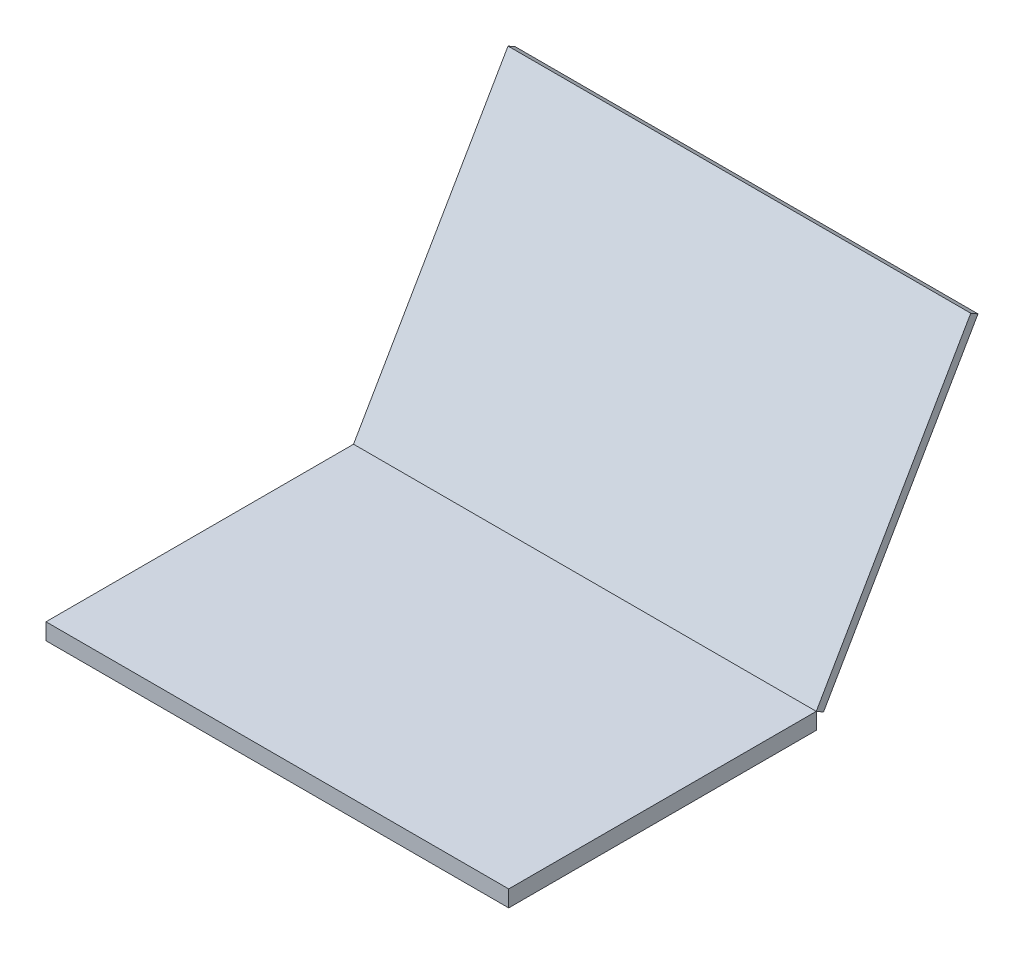
ISO-10303-21;
HEADER;
FILE_DESCRIPTION(('STEP AP214'),'2;1');
FILE_NAME('part.step','',(''),(''),'','','');
FILE_SCHEMA(('AUTOMOTIVE_DESIGN { 1 0 10303 214 1 1 1 1 }'));
ENDSEC;
DATA;
#1=APPLICATION_CONTEXT('core data for automotive mechanical design processes');
#2=APPLICATION_PROTOCOL_DEFINITION('international standard','automotive_design',2000,#1);
#3=PRODUCT_CONTEXT('',#1,'mechanical');
#4=PRODUCT('Part','Part','',(#3));
#5=PRODUCT_RELATED_PRODUCT_CATEGORY('part','',(#4));
#6=PRODUCT_DEFINITION_FORMATION('','',#4);
#7=PRODUCT_DEFINITION_CONTEXT('part definition',#1,'design');
#8=PRODUCT_DEFINITION('design','',#6,#7);
#9=PRODUCT_DEFINITION_SHAPE('','',#8);
#10=(LENGTH_UNIT() NAMED_UNIT(*) SI_UNIT(.MILLI.,.METRE.));
#11=(NAMED_UNIT(*) PLANE_ANGLE_UNIT() SI_UNIT($,.RADIAN.));
#12=(NAMED_UNIT(*) SI_UNIT($,.STERADIAN.) SOLID_ANGLE_UNIT());
#13=UNCERTAINTY_MEASURE_WITH_UNIT(LENGTH_MEASURE(1.E-05),#10,'distance_accuracy_value','');
#14=(GEOMETRIC_REPRESENTATION_CONTEXT(3) GLOBAL_UNCERTAINTY_ASSIGNED_CONTEXT((#13)) GLOBAL_UNIT_ASSIGNED_CONTEXT((#10,
#11,#12)) REPRESENTATION_CONTEXT('',''));
#15=CARTESIAN_POINT('',(0.,0.,0.));
#16=DIRECTION('',(0.,0.,1.));
#17=DIRECTION('',(1.,0.,0.));
#18=AXIS2_PLACEMENT_3D('',#15,#16,#17);
#19=CARTESIAN_POINT('',(165.5,11.78,-110.));
#20=DIRECTION('',(-1.,0.,0.));
#21=DIRECTION('',(0.,0.499999999999998,0.86602540378444));
#22=AXIS2_PLACEMENT_3D('',#19,#20,#21);
#23=PLANE('',#22);
#24=DIRECTION('',(0.,0.86602540378444,-0.499999999999998));
#25=VECTOR('',#24,1.);
#26=CARTESIAN_POINT('',(165.5,8.78000000000001,-115.196152422707));
#27=LINE('',#26,#25);
#28=CARTESIAN_POINT('',(165.5,8.78000000000001,-115.196152422707));
#29=VERTEX_POINT('',#28);
#30=CARTESIAN_POINT('',(165.5,200.171614236361,-225.696152422706));
#31=VERTEX_POINT('',#30);
#32=EDGE_CURVE('E110',#29,#31,#27,.T.);
#33=ORIENTED_EDGE('',*,*,#32,.T.);
#34=DIRECTION('',(0.,-0.499999999999998,-0.86602540378444));
#35=VECTOR('',#34,1.);
#36=CARTESIAN_POINT('',(165.5,203.171614236361,-220.5));
#37=LINE('',#36,#35);
#38=CARTESIAN_POINT('',(165.5,203.171614236361,-220.5));
#39=VERTEX_POINT('',#38);
#40=EDGE_CURVE('E12',#39,#31,#37,.T.);
#41=ORIENTED_EDGE('',*,*,#40,.F.);
#42=DIRECTION('',(0.,0.86602540378444,-0.499999999999998));
#43=VECTOR('',#42,1.);
#44=CARTESIAN_POINT('',(165.5,11.78,-110.));
#45=LINE('',#44,#43);
#46=CARTESIAN_POINT('',(165.5,11.78,-110.));
#47=VERTEX_POINT('',#46);
#48=EDGE_CURVE('E98',#47,#39,#45,.T.);
#49=ORIENTED_EDGE('',*,*,#48,.F.);
#50=DIRECTION('',(0.,-0.499999999999998,-0.86602540378444));
#51=VECTOR('',#50,1.);
#52=CARTESIAN_POINT('',(165.5,11.78,-110.));
#53=LINE('',#52,#51);
#54=EDGE_CURVE('E106',#47,#29,#53,.T.);
#55=ORIENTED_EDGE('',*,*,#54,.T.);
#56=EDGE_LOOP('',(#33,#41,#49,#55));
#57=FACE_BOUND('',#56,.T.);
#58=ADVANCED_FACE('F47',(#57),#23,.F.);
#59=CARTESIAN_POINT('',(-165.5,203.171614236361,-220.5));
#60=DIRECTION('',(0.,-0.86602540378444,0.499999999999998));
#61=DIRECTION('',(0.,-0.499999999999998,-0.86602540378444));
#62=AXIS2_PLACEMENT_3D('',#59,#60,#61);
#63=PLANE('',#62);
#64=DIRECTION('',(-1.,0.,0.));
#65=VECTOR('',#64,1.);
#66=CARTESIAN_POINT('',(-165.5,200.171614236361,-225.696152422706));
#67=LINE('',#66,#65);
#68=CARTESIAN_POINT('',(-165.5,200.171614236361,-225.696152422706));
#69=VERTEX_POINT('',#68);
#70=EDGE_CURVE('E102',#31,#69,#67,.T.);
#71=ORIENTED_EDGE('',*,*,#70,.T.);
#72=DIRECTION('',(0.,-0.499999999999998,-0.86602540378444));
#73=VECTOR('',#72,1.);
#74=CARTESIAN_POINT('',(-165.5,203.171614236361,-220.5));
#75=LINE('',#74,#73);
#76=CARTESIAN_POINT('',(-165.5,203.171614236361,-220.5));
#77=VERTEX_POINT('',#76);
#78=EDGE_CURVE('E55',#77,#69,#75,.T.);
#79=ORIENTED_EDGE('',*,*,#78,.F.);
#80=DIRECTION('',(-1.,0.,0.));
#81=VECTOR('',#80,1.);
#82=CARTESIAN_POINT('',(-165.5,203.171614236361,-220.5));
#83=LINE('',#82,#81);
#84=EDGE_CURVE('E93',#39,#77,#83,.T.);
#85=ORIENTED_EDGE('',*,*,#84,.F.);
#86=ORIENTED_EDGE('',*,*,#40,.T.);
#87=EDGE_LOOP('',(#71,#79,#85,#86));
#88=FACE_BOUND('',#87,.T.);
#89=ADVANCED_FACE('F101',(#88),#63,.F.);
#90=CARTESIAN_POINT('',(-165.5,11.78,-110.));
#91=DIRECTION('',(1.,0.,0.));
#92=DIRECTION('',(0.,-0.499999999999998,-0.86602540378444));
#93=AXIS2_PLACEMENT_3D('',#90,#91,#92);
#94=PLANE('',#93);
#95=DIRECTION('',(0.,-0.86602540378444,0.499999999999998));
#96=VECTOR('',#95,1.);
#97=CARTESIAN_POINT('',(-165.5,8.78000000000001,-115.196152422707));
#98=LINE('',#97,#96);
#99=CARTESIAN_POINT('',(-165.5,8.78000000000001,-115.196152422707));
#100=VERTEX_POINT('',#99);
#101=EDGE_CURVE('E80',#69,#100,#98,.T.);
#102=ORIENTED_EDGE('',*,*,#101,.T.);
#103=DIRECTION('',(0.,-0.499999999999998,-0.86602540378444));
#104=VECTOR('',#103,1.);
#105=CARTESIAN_POINT('',(-165.5,11.78,-110.));
#106=LINE('',#105,#104);
#107=CARTESIAN_POINT('',(-165.5,11.78,-110.));
#108=VERTEX_POINT('',#107);
#109=EDGE_CURVE('E103',#108,#100,#106,.T.);
#110=ORIENTED_EDGE('',*,*,#109,.F.);
#111=DIRECTION('',(0.,-0.86602540378444,0.499999999999998));
#112=VECTOR('',#111,1.);
#113=CARTESIAN_POINT('',(-165.5,11.78,-110.));
#114=LINE('',#113,#112);
#115=EDGE_CURVE('E96',#77,#108,#114,.T.);
#116=ORIENTED_EDGE('',*,*,#115,.F.);
#117=ORIENTED_EDGE('',*,*,#78,.T.);
#118=EDGE_LOOP('',(#102,#110,#116,#117));
#119=FACE_BOUND('',#118,.T.);
#120=ADVANCED_FACE('F104',(#119),#94,.F.);
#121=CARTESIAN_POINT('',(-165.5,11.78,-110.));
#122=DIRECTION('',(0.,0.86602540378444,-0.499999999999998));
#123=DIRECTION('',(0.,0.499999999999998,0.86602540378444));
#124=AXIS2_PLACEMENT_3D('',#121,#122,#123);
#125=PLANE('',#124);
#126=DIRECTION('',(1.,0.,0.));
#127=VECTOR('',#126,1.);
#128=CARTESIAN_POINT('',(-165.5,8.78000000000001,-115.196152422707));
#129=LINE('',#128,#127);
#130=EDGE_CURVE('E86',#100,#29,#129,.T.);
#131=ORIENTED_EDGE('',*,*,#130,.T.);
#132=ORIENTED_EDGE('',*,*,#54,.F.);
#133=DIRECTION('',(1.,0.,0.));
#134=VECTOR('',#133,1.);
#135=CARTESIAN_POINT('',(-165.5,11.78,-110.));
#136=LINE('',#135,#134);
#137=EDGE_CURVE('E63',#108,#47,#136,.T.);
#138=ORIENTED_EDGE('',*,*,#137,.F.);
#139=ORIENTED_EDGE('',*,*,#109,.T.);
#140=EDGE_LOOP('',(#131,#132,#138,#139));
#141=FACE_BOUND('',#140,.T.);
#142=ADVANCED_FACE('F117',(#141),#125,.F.);
#143=CARTESIAN_POINT('',(0.,107.475807118181,-165.25));
#144=DIRECTION('',(0.,-0.499999999999998,-0.86602540378444));
#145=DIRECTION('',(-1.,0.,0.));
#146=AXIS2_PLACEMENT_3D('',#143,#144,#145);
#147=PLANE('',#146);
#148=ORIENTED_EDGE('',*,*,#48,.T.);
#149=ORIENTED_EDGE('',*,*,#84,.T.);
#150=ORIENTED_EDGE('',*,*,#115,.T.);
#151=ORIENTED_EDGE('',*,*,#137,.T.);
#152=EDGE_LOOP('',(#148,#149,#150,#151));
#153=FACE_BOUND('',#152,.T.);
#154=ADVANCED_FACE('F94',(#153),#147,.F.);
#155=CARTESIAN_POINT('',(0.,104.475807118181,-170.446152422706));
#156=DIRECTION('',(0.,-0.499999999999998,-0.86602540378444));
#157=DIRECTION('',(-1.,0.,0.));
#158=AXIS2_PLACEMENT_3D('',#155,#156,#157);
#159=PLANE('',#158);
#160=ORIENTED_EDGE('',*,*,#32,.F.);
#161=ORIENTED_EDGE('',*,*,#130,.F.);
#162=ORIENTED_EDGE('',*,*,#101,.F.);
#163=ORIENTED_EDGE('',*,*,#70,.F.);
#164=EDGE_LOOP('',(#160,#161,#162,#163));
#165=FACE_BOUND('',#164,.T.);
#166=ADVANCED_FACE('F120',(#165),#159,.T.);
#167=CLOSED_SHELL('',(#58,#89,#120,#142,#154,#166));
#168=MANIFOLD_SOLID_BREP('B2',#167);
#169=CARTESIAN_POINT('',(165.5,11.78,110.));
#170=DIRECTION('',(-1.,0.,0.));
#171=DIRECTION('',(0.,0.,1.));
#172=AXIS2_PLACEMENT_3D('',#169,#170,#171);
#173=PLANE('',#172);
#174=DIRECTION('',(0.,0.,-1.));
#175=VECTOR('',#174,1.);
#176=CARTESIAN_POINT('',(165.5,0.,110.));
#177=LINE('',#176,#175);
#178=CARTESIAN_POINT('',(165.5,0.,110.));
#179=VERTEX_POINT('',#178);
#180=CARTESIAN_POINT('',(165.5,0.,-110.));
#181=VERTEX_POINT('',#180);
#182=EDGE_CURVE('E234',#179,#181,#177,.T.);
#183=ORIENTED_EDGE('',*,*,#182,.T.);
#184=DIRECTION('',(0.,-1.,0.));
#185=VECTOR('',#184,1.);
#186=CARTESIAN_POINT('',(165.5,11.78,-110.));
#187=LINE('',#186,#185);
#188=CARTESIAN_POINT('',(165.5,11.78,-110.));
#189=VERTEX_POINT('',#188);
#190=EDGE_CURVE('E45',#189,#181,#187,.T.);
#191=ORIENTED_EDGE('',*,*,#190,.F.);
#192=DIRECTION('',(0.,0.,-1.));
#193=VECTOR('',#192,1.);
#194=CARTESIAN_POINT('',(165.5,11.78,110.));
#195=LINE('',#194,#193);
#196=CARTESIAN_POINT('',(165.5,11.78,110.));
#197=VERTEX_POINT('',#196);
#198=EDGE_CURVE('E222',#197,#189,#195,.T.);
#199=ORIENTED_EDGE('',*,*,#198,.F.);
#200=DIRECTION('',(0.,-1.,0.));
#201=VECTOR('',#200,1.);
#202=CARTESIAN_POINT('',(165.5,11.78,110.));
#203=LINE('',#202,#201);
#204=EDGE_CURVE('E230',#197,#179,#203,.T.);
#205=ORIENTED_EDGE('',*,*,#204,.T.);
#206=EDGE_LOOP('',(#183,#191,#199,#205));
#207=FACE_BOUND('',#206,.T.);
#208=ADVANCED_FACE('F171',(#207),#173,.F.);
#209=CARTESIAN_POINT('',(-165.5,11.78,-110.));
#210=DIRECTION('',(0.,0.,1.));
#211=DIRECTION('',(1.,0.,0.));
#212=AXIS2_PLACEMENT_3D('',#209,#210,#211);
#213=PLANE('',#212);
#214=DIRECTION('',(-1.,0.,0.));
#215=VECTOR('',#214,1.);
#216=CARTESIAN_POINT('',(-165.5,0.,-110.));
#217=LINE('',#216,#215);
#218=CARTESIAN_POINT('',(-165.5,0.,-110.));
#219=VERTEX_POINT('',#218);
#220=EDGE_CURVE('E226',#181,#219,#217,.T.);
#221=ORIENTED_EDGE('',*,*,#220,.T.);
#222=DIRECTION('',(0.,-1.,0.));
#223=VECTOR('',#222,1.);
#224=CARTESIAN_POINT('',(-165.5,11.78,-110.));
#225=LINE('',#224,#223);
#226=CARTESIAN_POINT('',(-165.5,11.78,-110.));
#227=VERTEX_POINT('',#226);
#228=EDGE_CURVE('E179',#227,#219,#225,.T.);
#229=ORIENTED_EDGE('',*,*,#228,.F.);
#230=DIRECTION('',(-1.,0.,0.));
#231=VECTOR('',#230,1.);
#232=CARTESIAN_POINT('',(-165.5,11.78,-110.));
#233=LINE('',#232,#231);
#234=EDGE_CURVE('E217',#189,#227,#233,.T.);
#235=ORIENTED_EDGE('',*,*,#234,.F.);
#236=ORIENTED_EDGE('',*,*,#190,.T.);
#237=EDGE_LOOP('',(#221,#229,#235,#236));
#238=FACE_BOUND('',#237,.T.);
#239=ADVANCED_FACE('F225',(#238),#213,.F.);
#240=CARTESIAN_POINT('',(-165.5,11.78,110.));
#241=DIRECTION('',(1.,0.,0.));
#242=DIRECTION('',(0.,0.,-1.));
#243=AXIS2_PLACEMENT_3D('',#240,#241,#242);
#244=PLANE('',#243);
#245=DIRECTION('',(0.,0.,1.));
#246=VECTOR('',#245,1.);
#247=CARTESIAN_POINT('',(-165.5,0.,110.));
#248=LINE('',#247,#246);
#249=CARTESIAN_POINT('',(-165.5,0.,110.));
#250=VERTEX_POINT('',#249);
#251=EDGE_CURVE('E204',#219,#250,#248,.T.);
#252=ORIENTED_EDGE('',*,*,#251,.T.);
#253=DIRECTION('',(0.,-1.,0.));
#254=VECTOR('',#253,1.);
#255=CARTESIAN_POINT('',(-165.5,11.78,110.));
#256=LINE('',#255,#254);
#257=CARTESIAN_POINT('',(-165.5,11.78,110.));
#258=VERTEX_POINT('',#257);
#259=EDGE_CURVE('E227',#258,#250,#256,.T.);
#260=ORIENTED_EDGE('',*,*,#259,.F.);
#261=DIRECTION('',(0.,0.,1.));
#262=VECTOR('',#261,1.);
#263=CARTESIAN_POINT('',(-165.5,11.78,110.));
#264=LINE('',#263,#262);
#265=EDGE_CURVE('E220',#227,#258,#264,.T.);
#266=ORIENTED_EDGE('',*,*,#265,.F.);
#267=ORIENTED_EDGE('',*,*,#228,.T.);
#268=EDGE_LOOP('',(#252,#260,#266,#267));
#269=FACE_BOUND('',#268,.T.);
#270=ADVANCED_FACE('F228',(#269),#244,.F.);
#271=CARTESIAN_POINT('',(-165.5,11.78,110.));
#272=DIRECTION('',(0.,0.,-1.));
#273=DIRECTION('',(-1.,0.,0.));
#274=AXIS2_PLACEMENT_3D('',#271,#272,#273);
#275=PLANE('',#274);
#276=DIRECTION('',(1.,0.,0.));
#277=VECTOR('',#276,1.);
#278=CARTESIAN_POINT('',(-165.5,0.,110.));
#279=LINE('',#278,#277);
#280=EDGE_CURVE('E210',#250,#179,#279,.T.);
#281=ORIENTED_EDGE('',*,*,#280,.T.);
#282=ORIENTED_EDGE('',*,*,#204,.F.);
#283=DIRECTION('',(1.,0.,0.));
#284=VECTOR('',#283,1.);
#285=CARTESIAN_POINT('',(-165.5,11.78,110.));
#286=LINE('',#285,#284);
#287=EDGE_CURVE('E187',#258,#197,#286,.T.);
#288=ORIENTED_EDGE('',*,*,#287,.F.);
#289=ORIENTED_EDGE('',*,*,#259,.T.);
#290=EDGE_LOOP('',(#281,#282,#288,#289));
#291=FACE_BOUND('',#290,.T.);
#292=ADVANCED_FACE('F241',(#291),#275,.F.);
#293=CARTESIAN_POINT('',(0.,11.78,0.));
#294=DIRECTION('',(0.,-1.,0.));
#295=DIRECTION('',(0.,0.,-1.));
#296=AXIS2_PLACEMENT_3D('',#293,#294,#295);
#297=PLANE('',#296);
#298=ORIENTED_EDGE('',*,*,#198,.T.);
#299=ORIENTED_EDGE('',*,*,#234,.T.);
#300=ORIENTED_EDGE('',*,*,#265,.T.);
#301=ORIENTED_EDGE('',*,*,#287,.T.);
#302=EDGE_LOOP('',(#298,#299,#300,#301));
#303=FACE_BOUND('',#302,.T.);
#304=ADVANCED_FACE('F218',(#303),#297,.F.);
#305=CARTESIAN_POINT('',(0.,0.,0.));
#306=DIRECTION('',(0.,-1.,0.));
#307=DIRECTION('',(0.,0.,-1.));
#308=AXIS2_PLACEMENT_3D('',#305,#306,#307);
#309=PLANE('',#308);
#310=ORIENTED_EDGE('',*,*,#182,.F.);
#311=ORIENTED_EDGE('',*,*,#280,.F.);
#312=ORIENTED_EDGE('',*,*,#251,.F.);
#313=ORIENTED_EDGE('',*,*,#220,.F.);
#314=EDGE_LOOP('',(#310,#311,#312,#313));
#315=FACE_BOUND('',#314,.T.);
#316=ADVANCED_FACE('F244',(#315),#309,.T.);
#317=CLOSED_SHELL('',(#208,#239,#270,#292,#304,#316));
#318=MANIFOLD_SOLID_BREP('B6',#317);
#319=ADVANCED_BREP_SHAPE_REPRESENTATION('',(#18,#168,#318),#14);
#320=SHAPE_DEFINITION_REPRESENTATION(#9,#319);
ENDSEC;
END-ISO-10303-21;
